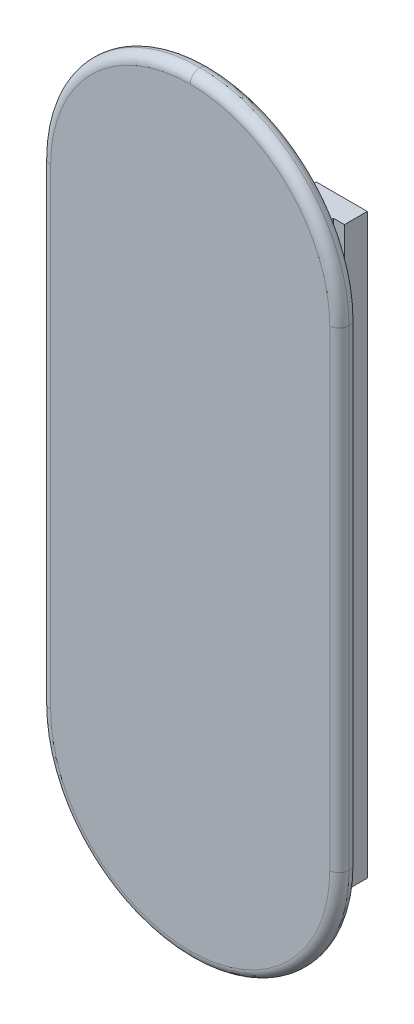
ISO-10303-21;
HEADER;
FILE_DESCRIPTION(('STEP AP214'),'2;1');
FILE_NAME('part.step','',(''),(''),'','','');
FILE_SCHEMA(('AUTOMOTIVE_DESIGN { 1 0 10303 214 1 1 1 1 }'));
ENDSEC;
DATA;
#1=APPLICATION_CONTEXT('core data for automotive mechanical design processes');
#2=APPLICATION_PROTOCOL_DEFINITION('international standard','automotive_design',2000,#1);
#3=PRODUCT_CONTEXT('',#1,'mechanical');
#4=PRODUCT('Part','Part','',(#3));
#5=PRODUCT_RELATED_PRODUCT_CATEGORY('part','',(#4));
#6=PRODUCT_DEFINITION_FORMATION('','',#4);
#7=PRODUCT_DEFINITION_CONTEXT('part definition',#1,'design');
#8=PRODUCT_DEFINITION('design','',#6,#7);
#9=PRODUCT_DEFINITION_SHAPE('','',#8);
#10=(LENGTH_UNIT() NAMED_UNIT(*) SI_UNIT(.MILLI.,.METRE.));
#11=(NAMED_UNIT(*) PLANE_ANGLE_UNIT() SI_UNIT($,.RADIAN.));
#12=(NAMED_UNIT(*) SI_UNIT($,.STERADIAN.) SOLID_ANGLE_UNIT());
#13=UNCERTAINTY_MEASURE_WITH_UNIT(LENGTH_MEASURE(1.E-05),#10,'distance_accuracy_value','');
#14=(GEOMETRIC_REPRESENTATION_CONTEXT(3) GLOBAL_UNCERTAINTY_ASSIGNED_CONTEXT((#13)) GLOBAL_UNIT_ASSIGNED_CONTEXT((#10,
#11,#12)) REPRESENTATION_CONTEXT('',''));
#15=CARTESIAN_POINT('',(0.,0.,0.));
#16=DIRECTION('',(0.,0.,1.));
#17=DIRECTION('',(1.,0.,0.));
#18=AXIS2_PLACEMENT_3D('',#15,#16,#17);
#19=CARTESIAN_POINT('',(0.,0.,0.));
#20=DIRECTION('',(0.,0.,1.));
#21=DIRECTION('',(1.,0.,0.));
#22=AXIS2_PLACEMENT_3D('',#19,#20,#21);
#23=PLANE('',#22);
#24=CARTESIAN_POINT('',(0.,-24.5,0.));
#25=DIRECTION('',(0.,0.,1.));
#26=DIRECTION('',(1.,0.,0.));
#27=AXIS2_PLACEMENT_3D('',#24,#25,#26);
#28=CIRCLE('',#27,14.5);
#29=CARTESIAN_POINT('',(0.,-39.,0.));
#30=VERTEX_POINT('',#29);
#31=CARTESIAN_POINT('',(-14.5,-24.5,0.));
#32=VERTEX_POINT('',#31);
#33=EDGE_CURVE('E377',#30,#32,#28,.F.);
#34=ORIENTED_EDGE('',*,*,#33,.T.);
#35=DIRECTION('',(0.,-1.,0.));
#36=VECTOR('',#35,1.);
#37=CARTESIAN_POINT('',(-14.5,0.,0.));
#38=LINE('',#37,#36);
#39=CARTESIAN_POINT('',(-14.5,24.5,0.));
#40=VERTEX_POINT('',#39);
#41=EDGE_CURVE('E379',#32,#40,#38,.F.);
#42=ORIENTED_EDGE('',*,*,#41,.T.);
#43=CARTESIAN_POINT('',(0.,24.5,0.));
#44=DIRECTION('',(0.,0.,1.));
#45=DIRECTION('',(1.,0.,0.));
#46=AXIS2_PLACEMENT_3D('',#43,#44,#45);
#47=CIRCLE('',#46,14.5);
#48=CARTESIAN_POINT('',(0.,39.,0.));
#49=VERTEX_POINT('',#48);
#50=EDGE_CURVE('E354',#40,#49,#47,.F.);
#51=ORIENTED_EDGE('',*,*,#50,.T.);
#52=CARTESIAN_POINT('',(0.,24.5,0.));
#53=DIRECTION('',(0.,0.,1.));
#54=DIRECTION('',(1.,0.,0.));
#55=AXIS2_PLACEMENT_3D('',#52,#53,#54);
#56=CIRCLE('',#55,14.5);
#57=CARTESIAN_POINT('',(14.5,24.5,0.));
#58=VERTEX_POINT('',#57);
#59=EDGE_CURVE('E371',#49,#58,#56,.F.);
#60=ORIENTED_EDGE('',*,*,#59,.T.);
#61=DIRECTION('',(0.,1.,0.));
#62=VECTOR('',#61,1.);
#63=CARTESIAN_POINT('',(14.5,0.,0.));
#64=LINE('',#63,#62);
#65=CARTESIAN_POINT('',(14.5,-24.5,0.));
#66=VERTEX_POINT('',#65);
#67=EDGE_CURVE('E373',#58,#66,#64,.F.);
#68=ORIENTED_EDGE('',*,*,#67,.T.);
#69=CARTESIAN_POINT('',(0.,-24.5,0.));
#70=DIRECTION('',(0.,0.,1.));
#71=DIRECTION('',(1.,0.,0.));
#72=AXIS2_PLACEMENT_3D('',#69,#70,#71);
#73=CIRCLE('',#72,14.5);
#74=EDGE_CURVE('E375',#66,#30,#73,.F.);
#75=ORIENTED_EDGE('',*,*,#74,.T.);
#76=EDGE_LOOP('',(#34,#42,#51,#60,#68,#75));
#77=FACE_BOUND('',#76,.T.);
#78=DIRECTION('',(-1.,0.,0.));
#79=VECTOR('',#78,1.);
#80=CARTESIAN_POINT('',(0.,-30.,0.));
#81=LINE('',#80,#79);
#82=CARTESIAN_POINT('',(-7.5,-30.,0.));
#83=VERTEX_POINT('',#82);
#84=CARTESIAN_POINT('',(-10.5,-30.,0.));
#85=VERTEX_POINT('',#84);
#86=EDGE_CURVE('E338',#83,#85,#81,.T.);
#87=ORIENTED_EDGE('',*,*,#86,.F.);
#88=DIRECTION('',(0.,1.,0.));
#89=VECTOR('',#88,1.);
#90=CARTESIAN_POINT('',(-7.5,-30.,0.));
#91=LINE('',#90,#89);
#92=CARTESIAN_POINT('',(-7.5,30.,0.));
#93=VERTEX_POINT('',#92);
#94=EDGE_CURVE('E361',#83,#93,#91,.T.);
#95=ORIENTED_EDGE('',*,*,#94,.T.);
#96=DIRECTION('',(-1.,0.,0.));
#97=VECTOR('',#96,1.);
#98=CARTESIAN_POINT('',(0.,30.,0.));
#99=LINE('',#98,#97);
#100=CARTESIAN_POINT('',(-10.5,30.,0.));
#101=VERTEX_POINT('',#100);
#102=EDGE_CURVE('E317',#93,#101,#99,.T.);
#103=ORIENTED_EDGE('',*,*,#102,.T.);
#104=DIRECTION('',(0.,1.,0.));
#105=VECTOR('',#104,1.);
#106=CARTESIAN_POINT('',(-10.5,-30.,0.));
#107=LINE('',#106,#105);
#108=EDGE_CURVE('E364',#85,#101,#107,.T.);
#109=ORIENTED_EDGE('',*,*,#108,.F.);
#110=EDGE_LOOP('',(#87,#95,#103,#109));
#111=FACE_BOUND('',#110,.T.);
#112=DIRECTION('',(1.,0.,0.));
#113=VECTOR('',#112,1.);
#114=CARTESIAN_POINT('',(0.,-30.,0.));
#115=LINE('',#114,#113);
#116=CARTESIAN_POINT('',(7.5,-30.,0.));
#117=VERTEX_POINT('',#116);
#118=CARTESIAN_POINT('',(10.5,-30.,0.));
#119=VERTEX_POINT('',#118);
#120=EDGE_CURVE('E288',#117,#119,#115,.T.);
#121=ORIENTED_EDGE('',*,*,#120,.T.);
#122=DIRECTION('',(0.,1.,0.));
#123=VECTOR('',#122,1.);
#124=CARTESIAN_POINT('',(10.5,-30.,0.));
#125=LINE('',#124,#123);
#126=CARTESIAN_POINT('',(10.5,30.,0.));
#127=VERTEX_POINT('',#126);
#128=EDGE_CURVE('E291',#119,#127,#125,.T.);
#129=ORIENTED_EDGE('',*,*,#128,.T.);
#130=DIRECTION('',(1.,0.,0.));
#131=VECTOR('',#130,1.);
#132=CARTESIAN_POINT('',(0.,30.,0.));
#133=LINE('',#132,#131);
#134=CARTESIAN_POINT('',(7.5,30.,0.));
#135=VERTEX_POINT('',#134);
#136=EDGE_CURVE('E269',#135,#127,#133,.T.);
#137=ORIENTED_EDGE('',*,*,#136,.F.);
#138=DIRECTION('',(0.,1.,0.));
#139=VECTOR('',#138,1.);
#140=CARTESIAN_POINT('',(7.5,-30.,0.));
#141=LINE('',#140,#139);
#142=EDGE_CURVE('E295',#117,#135,#141,.T.);
#143=ORIENTED_EDGE('',*,*,#142,.F.);
#144=EDGE_LOOP('',(#121,#129,#137,#143));
#145=FACE_BOUND('',#144,.T.);
#146=ADVANCED_FACE('F35',(#77,#111,#145),#23,.F.);
#147=CARTESIAN_POINT('',(0.,0.,2.));
#148=DIRECTION('',(0.,0.,1.));
#149=DIRECTION('',(1.,0.,0.));
#150=AXIS2_PLACEMENT_3D('',#147,#148,#149);
#151=PLANE('',#150);
#152=DIRECTION('',(0.,1.,0.));
#153=VECTOR('',#152,1.);
#154=CARTESIAN_POINT('',(14.5,24.5,2.));
#155=LINE('',#154,#153);
#156=CARTESIAN_POINT('',(14.5,-24.5,2.));
#157=VERTEX_POINT('',#156);
#158=CARTESIAN_POINT('',(14.5,24.5,2.));
#159=VERTEX_POINT('',#158);
#160=EDGE_CURVE('E45',#157,#159,#155,.T.);
#161=ORIENTED_EDGE('',*,*,#160,.T.);
#162=CARTESIAN_POINT('',(0.,24.5,2.));
#163=DIRECTION('',(0.,0.,1.));
#164=DIRECTION('',(1.,0.,0.));
#165=AXIS2_PLACEMENT_3D('',#162,#163,#164);
#166=CIRCLE('',#165,14.5);
#167=CARTESIAN_POINT('',(0.,39.,2.));
#168=VERTEX_POINT('',#167);
#169=EDGE_CURVE('E11',#159,#168,#166,.T.);
#170=ORIENTED_EDGE('',*,*,#169,.T.);
#171=CARTESIAN_POINT('',(0.,24.5,2.));
#172=DIRECTION('',(0.,0.,1.));
#173=DIRECTION('',(1.,0.,0.));
#174=AXIS2_PLACEMENT_3D('',#171,#172,#173);
#175=CIRCLE('',#174,14.5);
#176=CARTESIAN_POINT('',(-14.5,24.5,2.));
#177=VERTEX_POINT('',#176);
#178=EDGE_CURVE('E382',#168,#177,#175,.T.);
#179=ORIENTED_EDGE('',*,*,#178,.T.);
#180=DIRECTION('',(0.,-1.,0.));
#181=VECTOR('',#180,1.);
#182=CARTESIAN_POINT('',(-14.5,-24.5,2.));
#183=LINE('',#182,#181);
#184=CARTESIAN_POINT('',(-14.5,-24.5,2.));
#185=VERTEX_POINT('',#184);
#186=EDGE_CURVE('E214',#177,#185,#183,.T.);
#187=ORIENTED_EDGE('',*,*,#186,.T.);
#188=CARTESIAN_POINT('',(0.,-24.5,2.));
#189=DIRECTION('',(0.,0.,1.));
#190=DIRECTION('',(1.,0.,0.));
#191=AXIS2_PLACEMENT_3D('',#188,#189,#190);
#192=CIRCLE('',#191,14.5);
#193=CARTESIAN_POINT('',(0.,-39.,2.));
#194=VERTEX_POINT('',#193);
#195=EDGE_CURVE('E209',#185,#194,#192,.T.);
#196=ORIENTED_EDGE('',*,*,#195,.T.);
#197=CARTESIAN_POINT('',(0.,-24.5,2.));
#198=DIRECTION('',(0.,0.,1.));
#199=DIRECTION('',(1.,0.,0.));
#200=AXIS2_PLACEMENT_3D('',#197,#198,#199);
#201=CIRCLE('',#200,14.5);
#202=EDGE_CURVE('E212',#194,#157,#201,.T.);
#203=ORIENTED_EDGE('',*,*,#202,.T.);
#204=EDGE_LOOP('',(#161,#170,#179,#187,#196,#203));
#205=FACE_BOUND('',#204,.T.);
#206=ADVANCED_FACE('F211',(#205),#151,.T.);
#207=CARTESIAN_POINT('',(-11.65,-30.,0.));
#208=DIRECTION('',(1.,0.,0.));
#209=DIRECTION('',(0.,0.,-1.));
#210=AXIS2_PLACEMENT_3D('',#207,#208,#209);
#211=PLANE('',#210);
#212=DIRECTION('',(0.,1.,0.));
#213=VECTOR('',#212,1.);
#214=CARTESIAN_POINT('',(-11.65,-30.,-2.375));
#215=LINE('',#214,#213);
#216=CARTESIAN_POINT('',(-11.65,-30.,-2.375));
#217=VERTEX_POINT('',#216);
#218=CARTESIAN_POINT('',(-11.65,30.,-2.375));
#219=VERTEX_POINT('',#218);
#220=EDGE_CURVE('E351',#217,#219,#215,.T.);
#221=ORIENTED_EDGE('',*,*,#220,.T.);
#222=DIRECTION('',(0.,0.,-1.));
#223=VECTOR('',#222,1.);
#224=CARTESIAN_POINT('',(-11.65,30.,0.));
#225=LINE('',#224,#223);
#226=CARTESIAN_POINT('',(-11.65,30.,-4.75));
#227=VERTEX_POINT('',#226);
#228=EDGE_CURVE('E294',#219,#227,#225,.T.);
#229=ORIENTED_EDGE('',*,*,#228,.T.);
#230=DIRECTION('',(0.,1.,0.));
#231=VECTOR('',#230,1.);
#232=CARTESIAN_POINT('',(-11.65,-30.,-4.75));
#233=LINE('',#232,#231);
#234=CARTESIAN_POINT('',(-11.65,-30.,-4.75));
#235=VERTEX_POINT('',#234);
#236=EDGE_CURVE('E352',#235,#227,#233,.T.);
#237=ORIENTED_EDGE('',*,*,#236,.F.);
#238=DIRECTION('',(0.,0.,-1.));
#239=VECTOR('',#238,1.);
#240=CARTESIAN_POINT('',(-11.65,-30.,0.));
#241=LINE('',#240,#239);
#242=EDGE_CURVE('E332',#217,#235,#241,.T.);
#243=ORIENTED_EDGE('',*,*,#242,.F.);
#244=EDGE_LOOP('',(#221,#229,#237,#243));
#245=FACE_BOUND('',#244,.T.);
#246=ADVANCED_FACE('F455',(#245),#211,.F.);
#247=CARTESIAN_POINT('',(0.,-30.,-4.75));
#248=DIRECTION('',(0.,0.,-1.));
#249=DIRECTION('',(-1.,0.,0.));
#250=AXIS2_PLACEMENT_3D('',#247,#248,#249);
#251=PLANE('',#250);
#252=ORIENTED_EDGE('',*,*,#236,.T.);
#253=DIRECTION('',(-1.,0.,0.));
#254=VECTOR('',#253,1.);
#255=CARTESIAN_POINT('',(0.,30.,-4.75));
#256=LINE('',#255,#254);
#257=CARTESIAN_POINT('',(-6.35,30.,-4.75));
#258=VERTEX_POINT('',#257);
#259=EDGE_CURVE('E329',#258,#227,#256,.T.);
#260=ORIENTED_EDGE('',*,*,#259,.F.);
#261=DIRECTION('',(0.,1.,0.));
#262=VECTOR('',#261,1.);
#263=CARTESIAN_POINT('',(-6.35,-30.,-4.75));
#264=LINE('',#263,#262);
#265=CARTESIAN_POINT('',(-6.35,-30.,-4.75));
#266=VERTEX_POINT('',#265);
#267=EDGE_CURVE('E355',#266,#258,#264,.T.);
#268=ORIENTED_EDGE('',*,*,#267,.F.);
#269=DIRECTION('',(-1.,0.,0.));
#270=VECTOR('',#269,1.);
#271=CARTESIAN_POINT('',(0.,-30.,-4.75));
#272=LINE('',#271,#270);
#273=EDGE_CURVE('E348',#266,#235,#272,.T.);
#274=ORIENTED_EDGE('',*,*,#273,.T.);
#275=EDGE_LOOP('',(#252,#260,#268,#274));
#276=FACE_BOUND('',#275,.T.);
#277=ADVANCED_FACE('F681',(#276),#251,.T.);
#278=CARTESIAN_POINT('',(-6.35,-30.,0.));
#279=DIRECTION('',(1.,0.,0.));
#280=DIRECTION('',(0.,0.,-1.));
#281=AXIS2_PLACEMENT_3D('',#278,#279,#280);
#282=PLANE('',#281);
#283=ORIENTED_EDGE('',*,*,#267,.T.);
#284=DIRECTION('',(0.,0.,-1.));
#285=VECTOR('',#284,1.);
#286=CARTESIAN_POINT('',(-6.35,30.,0.));
#287=LINE('',#286,#285);
#288=CARTESIAN_POINT('',(-6.35,30.,-2.375));
#289=VERTEX_POINT('',#288);
#290=EDGE_CURVE('E326',#289,#258,#287,.T.);
#291=ORIENTED_EDGE('',*,*,#290,.F.);
#292=DIRECTION('',(0.,1.,0.));
#293=VECTOR('',#292,1.);
#294=CARTESIAN_POINT('',(-6.35,-30.,-2.375));
#295=LINE('',#294,#293);
#296=CARTESIAN_POINT('',(-6.35,-30.,-2.375));
#297=VERTEX_POINT('',#296);
#298=EDGE_CURVE('E357',#297,#289,#295,.T.);
#299=ORIENTED_EDGE('',*,*,#298,.F.);
#300=DIRECTION('',(0.,0.,-1.));
#301=VECTOR('',#300,1.);
#302=CARTESIAN_POINT('',(-6.35,-30.,0.));
#303=LINE('',#302,#301);
#304=EDGE_CURVE('E345',#297,#266,#303,.T.);
#305=ORIENTED_EDGE('',*,*,#304,.T.);
#306=EDGE_LOOP('',(#283,#291,#299,#305));
#307=FACE_BOUND('',#306,.T.);
#308=ADVANCED_FACE('F672',(#307),#282,.T.);
#309=CARTESIAN_POINT('',(0.,-30.,-2.37500000000001));
#310=DIRECTION('',(0.,0.,-1.));
#311=DIRECTION('',(-1.,0.,0.));
#312=AXIS2_PLACEMENT_3D('',#309,#310,#311);
#313=PLANE('',#312);
#314=ORIENTED_EDGE('',*,*,#298,.T.);
#315=DIRECTION('',(-1.,0.,0.));
#316=VECTOR('',#315,1.);
#317=CARTESIAN_POINT('',(0.,30.,-2.37500000000001));
#318=LINE('',#317,#316);
#319=CARTESIAN_POINT('',(-7.5,30.,-2.375));
#320=VERTEX_POINT('',#319);
#321=EDGE_CURVE('E323',#289,#320,#318,.T.);
#322=ORIENTED_EDGE('',*,*,#321,.T.);
#323=DIRECTION('',(0.,1.,0.));
#324=VECTOR('',#323,1.);
#325=CARTESIAN_POINT('',(-7.5,-30.,-2.375));
#326=LINE('',#325,#324);
#327=CARTESIAN_POINT('',(-7.5,-30.,-2.375));
#328=VERTEX_POINT('',#327);
#329=EDGE_CURVE('E359',#328,#320,#326,.T.);
#330=ORIENTED_EDGE('',*,*,#329,.F.);
#331=DIRECTION('',(-1.,0.,0.));
#332=VECTOR('',#331,1.);
#333=CARTESIAN_POINT('',(0.,-30.,-2.37500000000001));
#334=LINE('',#333,#332);
#335=EDGE_CURVE('E343',#297,#328,#334,.T.);
#336=ORIENTED_EDGE('',*,*,#335,.F.);
#337=EDGE_LOOP('',(#314,#322,#330,#336));
#338=FACE_BOUND('',#337,.T.);
#339=ADVANCED_FACE('F663',(#338),#313,.F.);
#340=CARTESIAN_POINT('',(-7.5,-30.,0.));
#341=DIRECTION('',(1.,0.,0.));
#342=DIRECTION('',(0.,0.,-1.));
#343=AXIS2_PLACEMENT_3D('',#340,#341,#342);
#344=PLANE('',#343);
#345=ORIENTED_EDGE('',*,*,#329,.T.);
#346=DIRECTION('',(0.,0.,-1.));
#347=VECTOR('',#346,1.);
#348=CARTESIAN_POINT('',(-7.5,30.,0.));
#349=LINE('',#348,#347);
#350=EDGE_CURVE('E320',#93,#320,#349,.T.);
#351=ORIENTED_EDGE('',*,*,#350,.F.);
#352=ORIENTED_EDGE('',*,*,#94,.F.);
#353=DIRECTION('',(0.,0.,-1.));
#354=VECTOR('',#353,1.);
#355=CARTESIAN_POINT('',(-7.5,-30.,0.));
#356=LINE('',#355,#354);
#357=EDGE_CURVE('E340',#83,#328,#356,.T.);
#358=ORIENTED_EDGE('',*,*,#357,.T.);
#359=EDGE_LOOP('',(#345,#351,#352,#358));
#360=FACE_BOUND('',#359,.T.);
#361=ADVANCED_FACE('F654',(#360),#344,.T.);
#362=CARTESIAN_POINT('',(-10.5,-30.,0.));
#363=DIRECTION('',(1.,0.,0.));
#364=DIRECTION('',(0.,0.,-1.));
#365=AXIS2_PLACEMENT_3D('',#362,#363,#364);
#366=PLANE('',#365);
#367=ORIENTED_EDGE('',*,*,#108,.T.);
#368=DIRECTION('',(0.,0.,-1.));
#369=VECTOR('',#368,1.);
#370=CARTESIAN_POINT('',(-10.5,30.,0.));
#371=LINE('',#370,#369);
#372=CARTESIAN_POINT('',(-10.5,30.,-2.375));
#373=VERTEX_POINT('',#372);
#374=EDGE_CURVE('E314',#101,#373,#371,.T.);
#375=ORIENTED_EDGE('',*,*,#374,.T.);
#376=DIRECTION('',(0.,1.,0.));
#377=VECTOR('',#376,1.);
#378=CARTESIAN_POINT('',(-10.5,-30.,-2.375));
#379=LINE('',#378,#377);
#380=CARTESIAN_POINT('',(-10.5,-30.,-2.375));
#381=VERTEX_POINT('',#380);
#382=EDGE_CURVE('E367',#381,#373,#379,.T.);
#383=ORIENTED_EDGE('',*,*,#382,.F.);
#384=DIRECTION('',(0.,0.,-1.));
#385=VECTOR('',#384,1.);
#386=CARTESIAN_POINT('',(-10.5,-30.,0.));
#387=LINE('',#386,#385);
#388=EDGE_CURVE('E336',#85,#381,#387,.T.);
#389=ORIENTED_EDGE('',*,*,#388,.F.);
#390=EDGE_LOOP('',(#367,#375,#383,#389));
#391=FACE_BOUND('',#390,.T.);
#392=ADVANCED_FACE('F645',(#391),#366,.F.);
#393=CARTESIAN_POINT('',(0.,-30.,-2.37500000000001));
#394=DIRECTION('',(0.,0.,-1.));
#395=DIRECTION('',(-1.,0.,0.));
#396=AXIS2_PLACEMENT_3D('',#393,#394,#395);
#397=PLANE('',#396);
#398=ORIENTED_EDGE('',*,*,#382,.T.);
#399=DIRECTION('',(-1.,0.,0.));
#400=VECTOR('',#399,1.);
#401=CARTESIAN_POINT('',(0.,30.,-2.37500000000001));
#402=LINE('',#401,#400);
#403=EDGE_CURVE('E311',#373,#219,#402,.T.);
#404=ORIENTED_EDGE('',*,*,#403,.T.);
#405=ORIENTED_EDGE('',*,*,#220,.F.);
#406=DIRECTION('',(-1.,0.,0.));
#407=VECTOR('',#406,1.);
#408=CARTESIAN_POINT('',(0.,-30.,-2.37500000000001));
#409=LINE('',#408,#407);
#410=EDGE_CURVE('E334',#381,#217,#409,.T.);
#411=ORIENTED_EDGE('',*,*,#410,.F.);
#412=EDGE_LOOP('',(#398,#404,#405,#411));
#413=FACE_BOUND('',#412,.T.);
#414=ADVANCED_FACE('F636',(#413),#397,.F.);
#415=CARTESIAN_POINT('',(0.,-30.,0.));
#416=DIRECTION('',(0.,1.,0.));
#417=DIRECTION('',(0.,0.,1.));
#418=AXIS2_PLACEMENT_3D('',#415,#416,#417);
#419=PLANE('',#418);
#420=ORIENTED_EDGE('',*,*,#242,.T.);
#421=ORIENTED_EDGE('',*,*,#273,.F.);
#422=ORIENTED_EDGE('',*,*,#304,.F.);
#423=ORIENTED_EDGE('',*,*,#335,.T.);
#424=ORIENTED_EDGE('',*,*,#357,.F.);
#425=ORIENTED_EDGE('',*,*,#86,.T.);
#426=ORIENTED_EDGE('',*,*,#388,.T.);
#427=ORIENTED_EDGE('',*,*,#410,.T.);
#428=EDGE_LOOP('',(#420,#421,#422,#423,#424,#425,#426,#427));
#429=FACE_BOUND('',#428,.T.);
#430=ADVANCED_FACE('F627',(#429),#419,.F.);
#431=CARTESIAN_POINT('',(0.,30.,0.));
#432=DIRECTION('',(0.,1.,0.));
#433=DIRECTION('',(0.,0.,1.));
#434=AXIS2_PLACEMENT_3D('',#431,#432,#433);
#435=PLANE('',#434);
#436=ORIENTED_EDGE('',*,*,#228,.F.);
#437=ORIENTED_EDGE('',*,*,#403,.F.);
#438=ORIENTED_EDGE('',*,*,#374,.F.);
#439=ORIENTED_EDGE('',*,*,#102,.F.);
#440=ORIENTED_EDGE('',*,*,#350,.T.);
#441=ORIENTED_EDGE('',*,*,#321,.F.);
#442=ORIENTED_EDGE('',*,*,#290,.T.);
#443=ORIENTED_EDGE('',*,*,#259,.T.);
#444=EDGE_LOOP('',(#436,#437,#438,#439,#440,#441,#442,#443));
#445=FACE_BOUND('',#444,.T.);
#446=ADVANCED_FACE('F619',(#445),#435,.T.);
#447=CARTESIAN_POINT('',(10.5,-30.,0.));
#448=DIRECTION('',(1.,0.,0.));
#449=DIRECTION('',(0.,0.,-1.));
#450=AXIS2_PLACEMENT_3D('',#447,#448,#449);
#451=PLANE('',#450);
#452=DIRECTION('',(0.,1.,0.));
#453=VECTOR('',#452,1.);
#454=CARTESIAN_POINT('',(10.5,-30.,-2.375));
#455=LINE('',#454,#453);
#456=CARTESIAN_POINT('',(10.5,-30.,-2.375));
#457=VERTEX_POINT('',#456);
#458=CARTESIAN_POINT('',(10.5,30.,-2.375));
#459=VERTEX_POINT('',#458);
#460=EDGE_CURVE('E87',#457,#459,#455,.T.);
#461=ORIENTED_EDGE('',*,*,#460,.T.);
#462=DIRECTION('',(0.,0.,-1.));
#463=VECTOR('',#462,1.);
#464=CARTESIAN_POINT('',(10.5,30.,0.));
#465=LINE('',#464,#463);
#466=EDGE_CURVE('E246',#127,#459,#465,.T.);
#467=ORIENTED_EDGE('',*,*,#466,.F.);
#468=ORIENTED_EDGE('',*,*,#128,.F.);
#469=DIRECTION('',(0.,0.,-1.));
#470=VECTOR('',#469,1.);
#471=CARTESIAN_POINT('',(10.5,-30.,0.));
#472=LINE('',#471,#470);
#473=EDGE_CURVE('E271',#119,#457,#472,.T.);
#474=ORIENTED_EDGE('',*,*,#473,.T.);
#475=EDGE_LOOP('',(#461,#467,#468,#474));
#476=FACE_BOUND('',#475,.T.);
#477=ADVANCED_FACE('F610',(#476),#451,.T.);
#478=CARTESIAN_POINT('',(7.5,-30.,0.));
#479=DIRECTION('',(1.,0.,0.));
#480=DIRECTION('',(0.,0.,-1.));
#481=AXIS2_PLACEMENT_3D('',#478,#479,#480);
#482=PLANE('',#481);
#483=ORIENTED_EDGE('',*,*,#142,.T.);
#484=DIRECTION('',(0.,0.,-1.));
#485=VECTOR('',#484,1.);
#486=CARTESIAN_POINT('',(7.5,30.,0.));
#487=LINE('',#486,#485);
#488=CARTESIAN_POINT('',(7.5,30.,-2.375));
#489=VERTEX_POINT('',#488);
#490=EDGE_CURVE('E266',#135,#489,#487,.T.);
#491=ORIENTED_EDGE('',*,*,#490,.T.);
#492=DIRECTION('',(0.,1.,0.));
#493=VECTOR('',#492,1.);
#494=CARTESIAN_POINT('',(7.5,-30.,-2.375));
#495=LINE('',#494,#493);
#496=CARTESIAN_POINT('',(7.5,-30.,-2.375));
#497=VERTEX_POINT('',#496);
#498=EDGE_CURVE('E298',#497,#489,#495,.T.);
#499=ORIENTED_EDGE('',*,*,#498,.F.);
#500=DIRECTION('',(0.,0.,-1.));
#501=VECTOR('',#500,1.);
#502=CARTESIAN_POINT('',(7.5,-30.,0.));
#503=LINE('',#502,#501);
#504=EDGE_CURVE('E286',#117,#497,#503,.T.);
#505=ORIENTED_EDGE('',*,*,#504,.F.);
#506=EDGE_LOOP('',(#483,#491,#499,#505));
#507=FACE_BOUND('',#506,.T.);
#508=ADVANCED_FACE('F601',(#507),#482,.F.);
#509=CARTESIAN_POINT('',(0.,-30.,-2.37500000000001));
#510=DIRECTION('',(0.,0.,1.));
#511=DIRECTION('',(1.,0.,0.));
#512=AXIS2_PLACEMENT_3D('',#509,#510,#511);
#513=PLANE('',#512);
#514=ORIENTED_EDGE('',*,*,#498,.T.);
#515=DIRECTION('',(1.,0.,0.));
#516=VECTOR('',#515,1.);
#517=CARTESIAN_POINT('',(0.,30.,-2.37500000000001));
#518=LINE('',#517,#516);
#519=CARTESIAN_POINT('',(6.35,30.,-2.375));
#520=VERTEX_POINT('',#519);
#521=EDGE_CURVE('E263',#520,#489,#518,.T.);
#522=ORIENTED_EDGE('',*,*,#521,.F.);
#523=DIRECTION('',(0.,1.,0.));
#524=VECTOR('',#523,1.);
#525=CARTESIAN_POINT('',(6.35,-30.,-2.375));
#526=LINE('',#525,#524);
#527=CARTESIAN_POINT('',(6.35,-30.,-2.375));
#528=VERTEX_POINT('',#527);
#529=EDGE_CURVE('E300',#528,#520,#526,.T.);
#530=ORIENTED_EDGE('',*,*,#529,.F.);
#531=DIRECTION('',(1.,0.,0.));
#532=VECTOR('',#531,1.);
#533=CARTESIAN_POINT('',(0.,-30.,-2.37500000000001));
#534=LINE('',#533,#532);
#535=EDGE_CURVE('E283',#528,#497,#534,.T.);
#536=ORIENTED_EDGE('',*,*,#535,.T.);
#537=EDGE_LOOP('',(#514,#522,#530,#536));
#538=FACE_BOUND('',#537,.T.);
#539=ADVANCED_FACE('F592',(#538),#513,.T.);
#540=CARTESIAN_POINT('',(6.35,-30.,0.));
#541=DIRECTION('',(1.,0.,0.));
#542=DIRECTION('',(0.,0.,-1.));
#543=AXIS2_PLACEMENT_3D('',#540,#541,#542);
#544=PLANE('',#543);
#545=ORIENTED_EDGE('',*,*,#529,.T.);
#546=DIRECTION('',(0.,0.,-1.));
#547=VECTOR('',#546,1.);
#548=CARTESIAN_POINT('',(6.35,30.,0.));
#549=LINE('',#548,#547);
#550=CARTESIAN_POINT('',(6.35,30.,-4.75));
#551=VERTEX_POINT('',#550);
#552=EDGE_CURVE('E260',#520,#551,#549,.T.);
#553=ORIENTED_EDGE('',*,*,#552,.T.);
#554=DIRECTION('',(0.,1.,0.));
#555=VECTOR('',#554,1.);
#556=CARTESIAN_POINT('',(6.35,-30.,-4.75));
#557=LINE('',#556,#555);
#558=CARTESIAN_POINT('',(6.35,-30.,-4.75));
#559=VERTEX_POINT('',#558);
#560=EDGE_CURVE('E302',#559,#551,#557,.T.);
#561=ORIENTED_EDGE('',*,*,#560,.F.);
#562=DIRECTION('',(0.,0.,-1.));
#563=VECTOR('',#562,1.);
#564=CARTESIAN_POINT('',(6.35,-30.,0.));
#565=LINE('',#564,#563);
#566=EDGE_CURVE('E281',#528,#559,#565,.T.);
#567=ORIENTED_EDGE('',*,*,#566,.F.);
#568=EDGE_LOOP('',(#545,#553,#561,#567));
#569=FACE_BOUND('',#568,.T.);
#570=ADVANCED_FACE('F583',(#569),#544,.F.);
#571=CARTESIAN_POINT('',(0.,-30.,-4.75));
#572=DIRECTION('',(0.,0.,1.));
#573=DIRECTION('',(1.,0.,0.));
#574=AXIS2_PLACEMENT_3D('',#571,#572,#573);
#575=PLANE('',#574);
#576=ORIENTED_EDGE('',*,*,#560,.T.);
#577=DIRECTION('',(1.,0.,0.));
#578=VECTOR('',#577,1.);
#579=CARTESIAN_POINT('',(0.,30.,-4.75));
#580=LINE('',#579,#578);
#581=CARTESIAN_POINT('',(11.65,30.,-4.75));
#582=VERTEX_POINT('',#581);
#583=EDGE_CURVE('E257',#551,#582,#580,.T.);
#584=ORIENTED_EDGE('',*,*,#583,.T.);
#585=DIRECTION('',(0.,1.,0.));
#586=VECTOR('',#585,1.);
#587=CARTESIAN_POINT('',(11.65,-30.,-4.75));
#588=LINE('',#587,#586);
#589=CARTESIAN_POINT('',(11.65,-30.,-4.75));
#590=VERTEX_POINT('',#589);
#591=EDGE_CURVE('E304',#590,#582,#588,.T.);
#592=ORIENTED_EDGE('',*,*,#591,.F.);
#593=DIRECTION('',(1.,0.,0.));
#594=VECTOR('',#593,1.);
#595=CARTESIAN_POINT('',(0.,-30.,-4.75));
#596=LINE('',#595,#594);
#597=EDGE_CURVE('E279',#559,#590,#596,.T.);
#598=ORIENTED_EDGE('',*,*,#597,.F.);
#599=EDGE_LOOP('',(#576,#584,#592,#598));
#600=FACE_BOUND('',#599,.T.);
#601=ADVANCED_FACE('F574',(#600),#575,.F.);
#602=CARTESIAN_POINT('',(11.65,-30.,0.));
#603=DIRECTION('',(1.,0.,0.));
#604=DIRECTION('',(0.,0.,-1.));
#605=AXIS2_PLACEMENT_3D('',#602,#603,#604);
#606=PLANE('',#605);
#607=ORIENTED_EDGE('',*,*,#591,.T.);
#608=DIRECTION('',(0.,0.,-1.));
#609=VECTOR('',#608,1.);
#610=CARTESIAN_POINT('',(11.65,30.,0.));
#611=LINE('',#610,#609);
#612=CARTESIAN_POINT('',(11.65,30.,-2.375));
#613=VERTEX_POINT('',#612);
#614=EDGE_CURVE('E252',#613,#582,#611,.T.);
#615=ORIENTED_EDGE('',*,*,#614,.F.);
#616=DIRECTION('',(0.,1.,0.));
#617=VECTOR('',#616,1.);
#618=CARTESIAN_POINT('',(11.65,-30.,-2.375));
#619=LINE('',#618,#617);
#620=CARTESIAN_POINT('',(11.65,-30.,-2.375));
#621=VERTEX_POINT('',#620);
#622=EDGE_CURVE('E306',#621,#613,#619,.T.);
#623=ORIENTED_EDGE('',*,*,#622,.F.);
#624=DIRECTION('',(0.,0.,-1.));
#625=VECTOR('',#624,1.);
#626=CARTESIAN_POINT('',(11.65,-30.,0.));
#627=LINE('',#626,#625);
#628=EDGE_CURVE('E276',#621,#590,#627,.T.);
#629=ORIENTED_EDGE('',*,*,#628,.T.);
#630=EDGE_LOOP('',(#607,#615,#623,#629));
#631=FACE_BOUND('',#630,.T.);
#632=ADVANCED_FACE('F565',(#631),#606,.T.);
#633=CARTESIAN_POINT('',(0.,-30.,-2.37500000000001));
#634=DIRECTION('',(0.,0.,1.));
#635=DIRECTION('',(1.,0.,0.));
#636=AXIS2_PLACEMENT_3D('',#633,#634,#635);
#637=PLANE('',#636);
#638=ORIENTED_EDGE('',*,*,#622,.T.);
#639=DIRECTION('',(1.,0.,0.));
#640=VECTOR('',#639,1.);
#641=CARTESIAN_POINT('',(0.,30.,-2.37500000000001));
#642=LINE('',#641,#640);
#643=EDGE_CURVE('E248',#459,#613,#642,.T.);
#644=ORIENTED_EDGE('',*,*,#643,.F.);
#645=ORIENTED_EDGE('',*,*,#460,.F.);
#646=DIRECTION('',(1.,0.,0.));
#647=VECTOR('',#646,1.);
#648=CARTESIAN_POINT('',(0.,-30.,-2.37500000000001));
#649=LINE('',#648,#647);
#650=EDGE_CURVE('E273',#457,#621,#649,.T.);
#651=ORIENTED_EDGE('',*,*,#650,.T.);
#652=EDGE_LOOP('',(#638,#644,#645,#651));
#653=FACE_BOUND('',#652,.T.);
#654=ADVANCED_FACE('F556',(#653),#637,.T.);
#655=CARTESIAN_POINT('',(0.,-30.,0.));
#656=DIRECTION('',(0.,1.,0.));
#657=DIRECTION('',(0.,0.,1.));
#658=AXIS2_PLACEMENT_3D('',#655,#656,#657);
#659=PLANE('',#658);
#660=ORIENTED_EDGE('',*,*,#473,.F.);
#661=ORIENTED_EDGE('',*,*,#120,.F.);
#662=ORIENTED_EDGE('',*,*,#504,.T.);
#663=ORIENTED_EDGE('',*,*,#535,.F.);
#664=ORIENTED_EDGE('',*,*,#566,.T.);
#665=ORIENTED_EDGE('',*,*,#597,.T.);
#666=ORIENTED_EDGE('',*,*,#628,.F.);
#667=ORIENTED_EDGE('',*,*,#650,.F.);
#668=EDGE_LOOP('',(#660,#661,#662,#663,#664,#665,#666,#667));
#669=FACE_BOUND('',#668,.T.);
#670=ADVANCED_FACE('F548',(#669),#659,.F.);
#671=CARTESIAN_POINT('',(0.,30.,0.));
#672=DIRECTION('',(0.,1.,0.));
#673=DIRECTION('',(0.,0.,1.));
#674=AXIS2_PLACEMENT_3D('',#671,#672,#673);
#675=PLANE('',#674);
#676=ORIENTED_EDGE('',*,*,#466,.T.);
#677=ORIENTED_EDGE('',*,*,#643,.T.);
#678=ORIENTED_EDGE('',*,*,#614,.T.);
#679=ORIENTED_EDGE('',*,*,#583,.F.);
#680=ORIENTED_EDGE('',*,*,#552,.F.);
#681=ORIENTED_EDGE('',*,*,#521,.T.);
#682=ORIENTED_EDGE('',*,*,#490,.F.);
#683=ORIENTED_EDGE('',*,*,#136,.T.);
#684=EDGE_LOOP('',(#676,#677,#678,#679,#680,#681,#682,#683));
#685=FACE_BOUND('',#684,.T.);
#686=ADVANCED_FACE('F540',(#685),#675,.T.);
#687=CARTESIAN_POINT('',(14.5,0.,1.));
#688=DIRECTION('',(0.,-1.,0.));
#689=DIRECTION('',(0.,0.,-1.));
#690=AXIS2_PLACEMENT_3D('',#687,#688,#689);
#691=CYLINDRICAL_SURFACE('',#690,1.);
#692=CARTESIAN_POINT('',(14.5,24.5,1.));
#693=DIRECTION('',(0.,1.,0.));
#694=DIRECTION('',(0.,0.,1.));
#695=AXIS2_PLACEMENT_3D('',#692,#693,#694);
#696=CIRCLE('',#695,1.);
#697=CARTESIAN_POINT('',(15.5,24.5,1.));
#698=VERTEX_POINT('',#697);
#699=EDGE_CURVE('E39',#159,#698,#696,.T.);
#700=ORIENTED_EDGE('',*,*,#699,.F.);
#701=ORIENTED_EDGE('',*,*,#160,.F.);
#702=CARTESIAN_POINT('',(14.5,-24.5,1.));
#703=DIRECTION('',(0.,-1.,0.));
#704=DIRECTION('',(0.,0.,-1.));
#705=AXIS2_PLACEMENT_3D('',#702,#703,#704);
#706=CIRCLE('',#705,1.);
#707=CARTESIAN_POINT('',(15.5,-24.5,1.));
#708=VERTEX_POINT('',#707);
#709=EDGE_CURVE('E74',#708,#157,#706,.T.);
#710=ORIENTED_EDGE('',*,*,#709,.F.);
#711=DIRECTION('',(0.,1.,0.));
#712=VECTOR('',#711,1.);
#713=CARTESIAN_POINT('',(15.5,-24.5,1.));
#714=LINE('',#713,#712);
#715=EDGE_CURVE('E245',#698,#708,#714,.F.);
#716=ORIENTED_EDGE('',*,*,#715,.F.);
#717=EDGE_LOOP('',(#700,#701,#710,#716));
#718=FACE_BOUND('',#717,.T.);
#719=ADVANCED_FACE('F37',(#718),#691,.T.);
#720=CARTESIAN_POINT('',(0.,24.5,1.));
#721=DIRECTION('',(0.,0.,1.));
#722=DIRECTION('',(1.,0.,0.));
#723=AXIS2_PLACEMENT_3D('',#720,#721,#722);
#724=TOROIDAL_SURFACE('',#723,14.5,1.);
#725=ORIENTED_EDGE('',*,*,#169,.F.);
#726=ORIENTED_EDGE('',*,*,#699,.T.);
#727=CARTESIAN_POINT('',(0.,24.5,1.));
#728=DIRECTION('',(0.,0.,1.));
#729=DIRECTION('',(1.,0.,0.));
#730=AXIS2_PLACEMENT_3D('',#727,#728,#729);
#731=CIRCLE('',#730,15.5);
#732=CARTESIAN_POINT('',(0.,40.,1.));
#733=VERTEX_POINT('',#732);
#734=EDGE_CURVE('E234',#733,#698,#731,.F.);
#735=ORIENTED_EDGE('',*,*,#734,.F.);
#736=CARTESIAN_POINT('',(0.,39.,1.));
#737=DIRECTION('',(-1.,0.,0.));
#738=DIRECTION('',(0.,-1.,0.));
#739=AXIS2_PLACEMENT_3D('',#736,#737,#738);
#740=CIRCLE('',#739,1.);
#741=EDGE_CURVE('E230',#168,#733,#740,.T.);
#742=ORIENTED_EDGE('',*,*,#741,.F.);
#743=EDGE_LOOP('',(#725,#726,#735,#742));
#744=FACE_BOUND('',#743,.T.);
#745=ADVANCED_FACE('F418',(#744),#724,.T.);
#746=CARTESIAN_POINT('',(0.,-24.5,1.));
#747=DIRECTION('',(0.,0.,1.));
#748=DIRECTION('',(1.,0.,0.));
#749=AXIS2_PLACEMENT_3D('',#746,#747,#748);
#750=TOROIDAL_SURFACE('',#749,14.5,1.);
#751=ORIENTED_EDGE('',*,*,#709,.T.);
#752=ORIENTED_EDGE('',*,*,#202,.F.);
#753=CARTESIAN_POINT('',(0.,-39.,1.));
#754=DIRECTION('',(-1.,0.,0.));
#755=DIRECTION('',(0.,-1.,0.));
#756=AXIS2_PLACEMENT_3D('',#753,#754,#755);
#757=CIRCLE('',#756,1.);
#758=CARTESIAN_POINT('',(0.,-40.,1.));
#759=VERTEX_POINT('',#758);
#760=EDGE_CURVE('E222',#759,#194,#757,.T.);
#761=ORIENTED_EDGE('',*,*,#760,.F.);
#762=CARTESIAN_POINT('',(0.,-24.5,1.));
#763=DIRECTION('',(0.,0.,1.));
#764=DIRECTION('',(1.,0.,0.));
#765=AXIS2_PLACEMENT_3D('',#762,#763,#764);
#766=CIRCLE('',#765,15.5);
#767=EDGE_CURVE('E231',#708,#759,#766,.F.);
#768=ORIENTED_EDGE('',*,*,#767,.F.);
#769=EDGE_LOOP('',(#751,#752,#761,#768));
#770=FACE_BOUND('',#769,.T.);
#771=ADVANCED_FACE('F220',(#770),#750,.T.);
#772=CARTESIAN_POINT('',(14.5,-40.,1.));
#773=DIRECTION('',(0.,1.,0.));
#774=DIRECTION('',(0.,0.,1.));
#775=AXIS2_PLACEMENT_3D('',#772,#773,#774);
#776=CYLINDRICAL_SURFACE('',#775,1.);
#777=CARTESIAN_POINT('',(14.5,-24.5,1.));
#778=DIRECTION('',(0.,-1.,0.));
#779=DIRECTION('',(0.,0.,-1.));
#780=AXIS2_PLACEMENT_3D('',#777,#778,#779);
#781=CIRCLE('',#780,1.);
#782=EDGE_CURVE('E236',#66,#708,#781,.T.);
#783=ORIENTED_EDGE('',*,*,#782,.F.);
#784=ORIENTED_EDGE('',*,*,#67,.F.);
#785=CARTESIAN_POINT('',(14.5,24.5,1.));
#786=DIRECTION('',(0.,1.,0.));
#787=DIRECTION('',(0.,0.,1.));
#788=AXIS2_PLACEMENT_3D('',#785,#786,#787);
#789=CIRCLE('',#788,1.);
#790=EDGE_CURVE('E242',#698,#58,#789,.T.);
#791=ORIENTED_EDGE('',*,*,#790,.F.);
#792=ORIENTED_EDGE('',*,*,#715,.T.);
#793=EDGE_LOOP('',(#783,#784,#791,#792));
#794=FACE_BOUND('',#793,.T.);
#795=ADVANCED_FACE('F415',(#794),#776,.T.);
#796=CARTESIAN_POINT('',(0.,24.5,1.));
#797=DIRECTION('',(0.,0.,1.));
#798=DIRECTION('',(1.,0.,0.));
#799=AXIS2_PLACEMENT_3D('',#796,#797,#798);
#800=TOROIDAL_SURFACE('',#799,14.5,1.);
#801=ORIENTED_EDGE('',*,*,#790,.T.);
#802=ORIENTED_EDGE('',*,*,#59,.F.);
#803=CARTESIAN_POINT('',(0.,39.,1.));
#804=DIRECTION('',(-1.,0.,0.));
#805=DIRECTION('',(0.,-1.,0.));
#806=AXIS2_PLACEMENT_3D('',#803,#804,#805);
#807=CIRCLE('',#806,1.);
#808=EDGE_CURVE('E405',#733,#49,#807,.T.);
#809=ORIENTED_EDGE('',*,*,#808,.F.);
#810=ORIENTED_EDGE('',*,*,#734,.T.);
#811=EDGE_LOOP('',(#801,#802,#809,#810));
#812=FACE_BOUND('',#811,.T.);
#813=ADVANCED_FACE('F441',(#812),#800,.T.);
#814=CARTESIAN_POINT('',(0.,24.5,1.));
#815=DIRECTION('',(0.,0.,1.));
#816=DIRECTION('',(1.,0.,0.));
#817=AXIS2_PLACEMENT_3D('',#814,#815,#816);
#818=TOROIDAL_SURFACE('',#817,14.5,1.);
#819=ORIENTED_EDGE('',*,*,#178,.F.);
#820=ORIENTED_EDGE('',*,*,#741,.T.);
#821=CARTESIAN_POINT('',(0.,24.5,1.));
#822=DIRECTION('',(0.,0.,1.));
#823=DIRECTION('',(1.,0.,0.));
#824=AXIS2_PLACEMENT_3D('',#821,#822,#823);
#825=CIRCLE('',#824,15.5);
#826=CARTESIAN_POINT('',(-15.5,24.5,1.));
#827=VERTEX_POINT('',#826);
#828=EDGE_CURVE('E402',#827,#733,#825,.F.);
#829=ORIENTED_EDGE('',*,*,#828,.F.);
#830=CARTESIAN_POINT('',(-14.5,24.5,1.));
#831=DIRECTION('',(0.,-1.,0.));
#832=DIRECTION('',(0.,0.,-1.));
#833=AXIS2_PLACEMENT_3D('',#830,#831,#832);
#834=CIRCLE('',#833,1.);
#835=EDGE_CURVE('E399',#177,#827,#834,.T.);
#836=ORIENTED_EDGE('',*,*,#835,.F.);
#837=EDGE_LOOP('',(#819,#820,#829,#836));
#838=FACE_BOUND('',#837,.T.);
#839=ADVANCED_FACE('F421',(#838),#818,.T.);
#840=CARTESIAN_POINT('',(0.,-24.5,1.));
#841=DIRECTION('',(0.,0.,1.));
#842=DIRECTION('',(1.,0.,0.));
#843=AXIS2_PLACEMENT_3D('',#840,#841,#842);
#844=TOROIDAL_SURFACE('',#843,14.5,1.);
#845=ORIENTED_EDGE('',*,*,#760,.T.);
#846=ORIENTED_EDGE('',*,*,#195,.F.);
#847=CARTESIAN_POINT('',(-14.5,-24.5,1.));
#848=DIRECTION('',(0.,1.,0.));
#849=DIRECTION('',(0.,0.,1.));
#850=AXIS2_PLACEMENT_3D('',#847,#848,#849);
#851=CIRCLE('',#850,1.);
#852=CARTESIAN_POINT('',(-15.5,-24.5,1.));
#853=VERTEX_POINT('',#852);
#854=EDGE_CURVE('E397',#853,#185,#851,.T.);
#855=ORIENTED_EDGE('',*,*,#854,.F.);
#856=CARTESIAN_POINT('',(0.,-24.5,1.));
#857=DIRECTION('',(0.,0.,1.));
#858=DIRECTION('',(1.,0.,0.));
#859=AXIS2_PLACEMENT_3D('',#856,#857,#858);
#860=CIRCLE('',#859,15.5);
#861=EDGE_CURVE('E228',#759,#853,#860,.F.);
#862=ORIENTED_EDGE('',*,*,#861,.F.);
#863=EDGE_LOOP('',(#845,#846,#855,#862));
#864=FACE_BOUND('',#863,.T.);
#865=ADVANCED_FACE('F226',(#864),#844,.T.);
#866=CARTESIAN_POINT('',(0.,-24.5,1.));
#867=DIRECTION('',(0.,0.,1.));
#868=DIRECTION('',(1.,0.,0.));
#869=AXIS2_PLACEMENT_3D('',#866,#867,#868);
#870=TOROIDAL_SURFACE('',#869,14.5,1.);
#871=ORIENTED_EDGE('',*,*,#782,.T.);
#872=ORIENTED_EDGE('',*,*,#767,.T.);
#873=CARTESIAN_POINT('',(0.,-39.,1.));
#874=DIRECTION('',(-1.,0.,0.));
#875=DIRECTION('',(0.,-1.,0.));
#876=AXIS2_PLACEMENT_3D('',#873,#874,#875);
#877=CIRCLE('',#876,1.);
#878=EDGE_CURVE('E394',#30,#759,#877,.T.);
#879=ORIENTED_EDGE('',*,*,#878,.F.);
#880=ORIENTED_EDGE('',*,*,#74,.F.);
#881=EDGE_LOOP('',(#871,#872,#879,#880));
#882=FACE_BOUND('',#881,.T.);
#883=ADVANCED_FACE('F411',(#882),#870,.T.);
#884=CARTESIAN_POINT('',(0.,24.5,1.));
#885=DIRECTION('',(0.,0.,1.));
#886=DIRECTION('',(1.,0.,0.));
#887=AXIS2_PLACEMENT_3D('',#884,#885,#886);
#888=TOROIDAL_SURFACE('',#887,14.5,1.);
#889=ORIENTED_EDGE('',*,*,#808,.T.);
#890=ORIENTED_EDGE('',*,*,#50,.F.);
#891=CARTESIAN_POINT('',(-14.5,24.5,1.));
#892=DIRECTION('',(0.,-1.,0.));
#893=DIRECTION('',(0.,0.,-1.));
#894=AXIS2_PLACEMENT_3D('',#891,#892,#893);
#895=CIRCLE('',#894,1.);
#896=EDGE_CURVE('E392',#827,#40,#895,.T.);
#897=ORIENTED_EDGE('',*,*,#896,.F.);
#898=ORIENTED_EDGE('',*,*,#828,.T.);
#899=EDGE_LOOP('',(#889,#890,#897,#898));
#900=FACE_BOUND('',#899,.T.);
#901=ADVANCED_FACE('F437',(#900),#888,.T.);
#902=CARTESIAN_POINT('',(-14.5,0.,1.));
#903=DIRECTION('',(0.,1.,0.));
#904=DIRECTION('',(0.,0.,1.));
#905=AXIS2_PLACEMENT_3D('',#902,#903,#904);
#906=CYLINDRICAL_SURFACE('',#905,1.);
#907=ORIENTED_EDGE('',*,*,#186,.F.);
#908=ORIENTED_EDGE('',*,*,#835,.T.);
#909=DIRECTION('',(0.,-1.,0.));
#910=VECTOR('',#909,1.);
#911=CARTESIAN_POINT('',(-15.5,24.5,1.));
#912=LINE('',#911,#910);
#913=EDGE_CURVE('E389',#853,#827,#912,.F.);
#914=ORIENTED_EDGE('',*,*,#913,.F.);
#915=ORIENTED_EDGE('',*,*,#854,.T.);
#916=EDGE_LOOP('',(#907,#908,#914,#915));
#917=FACE_BOUND('',#916,.T.);
#918=ADVANCED_FACE('F425',(#917),#906,.T.);
#919=CARTESIAN_POINT('',(0.,-24.5,1.));
#920=DIRECTION('',(0.,0.,1.));
#921=DIRECTION('',(1.,0.,0.));
#922=AXIS2_PLACEMENT_3D('',#919,#920,#921);
#923=TOROIDAL_SURFACE('',#922,14.5,1.);
#924=ORIENTED_EDGE('',*,*,#878,.T.);
#925=ORIENTED_EDGE('',*,*,#861,.T.);
#926=CARTESIAN_POINT('',(-14.5,-24.5,1.));
#927=DIRECTION('',(0.,1.,0.));
#928=DIRECTION('',(0.,0.,1.));
#929=AXIS2_PLACEMENT_3D('',#926,#927,#928);
#930=CIRCLE('',#929,1.);
#931=EDGE_CURVE('E386',#32,#853,#930,.T.);
#932=ORIENTED_EDGE('',*,*,#931,.F.);
#933=ORIENTED_EDGE('',*,*,#33,.F.);
#934=EDGE_LOOP('',(#924,#925,#932,#933));
#935=FACE_BOUND('',#934,.T.);
#936=ADVANCED_FACE('F428',(#935),#923,.T.);
#937=CARTESIAN_POINT('',(-14.5,-40.,1.));
#938=DIRECTION('',(0.,-1.,0.));
#939=DIRECTION('',(0.,0.,-1.));
#940=AXIS2_PLACEMENT_3D('',#937,#938,#939);
#941=CYLINDRICAL_SURFACE('',#940,1.);
#942=ORIENTED_EDGE('',*,*,#896,.T.);
#943=ORIENTED_EDGE('',*,*,#41,.F.);
#944=ORIENTED_EDGE('',*,*,#931,.T.);
#945=ORIENTED_EDGE('',*,*,#913,.T.);
#946=EDGE_LOOP('',(#942,#943,#944,#945));
#947=FACE_BOUND('',#946,.T.);
#948=ADVANCED_FACE('F434',(#947),#941,.T.);
#949=CLOSED_SHELL('',(#146,#206,#246,#277,#308,#339,#361,#392,#414,#430,#446,#477,#508,#539,
#570,#601,#632,#654,#670,#686,#719,#745,#771,#795,#813,#839,#865,#883,#901,#918,#936,#948));
#950=MANIFOLD_SOLID_BREP('B2',#949);
#951=ADVANCED_BREP_SHAPE_REPRESENTATION('',(#18,#950),#14);
#952=SHAPE_DEFINITION_REPRESENTATION(#9,#951);
ENDSEC;
END-ISO-10303-21;
